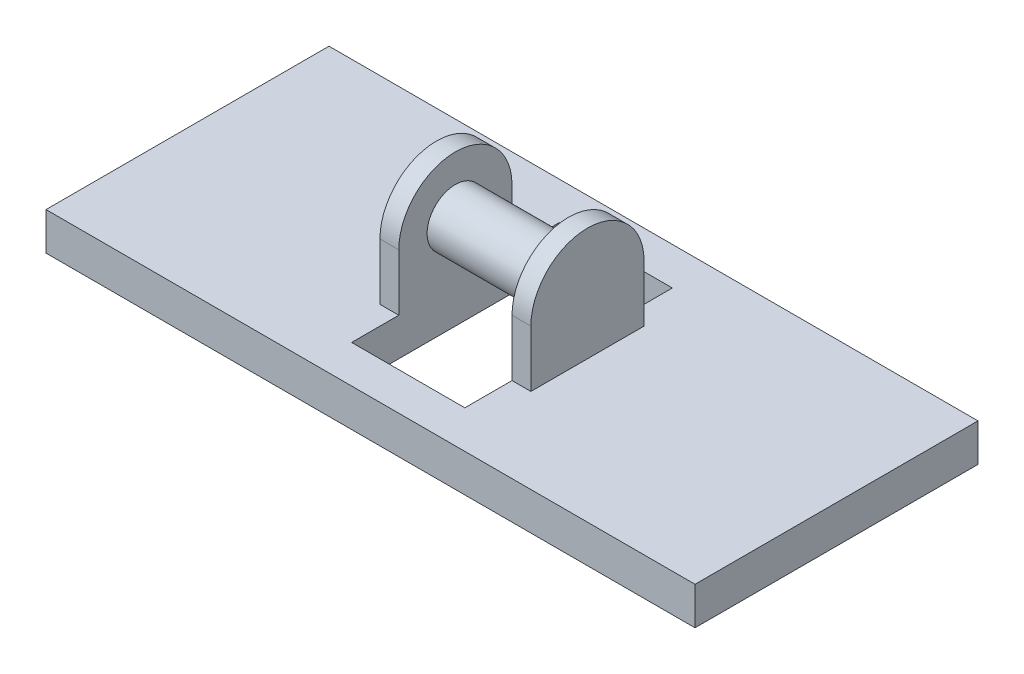
ISO-10303-21;
HEADER;
FILE_DESCRIPTION(('STEP AP214'),'2;1');
FILE_NAME('part.step','',(''),(''),'','','');
FILE_SCHEMA(('AUTOMOTIVE_DESIGN { 1 0 10303 214 1 1 1 1 }'));
ENDSEC;
DATA;
#1=APPLICATION_CONTEXT('core data for automotive mechanical design processes');
#2=APPLICATION_PROTOCOL_DEFINITION('international standard','automotive_design',2000,#1);
#3=PRODUCT_CONTEXT('',#1,'mechanical');
#4=PRODUCT('Part','Part','',(#3));
#5=PRODUCT_RELATED_PRODUCT_CATEGORY('part','',(#4));
#6=PRODUCT_DEFINITION_FORMATION('','',#4);
#7=PRODUCT_DEFINITION_CONTEXT('part definition',#1,'design');
#8=PRODUCT_DEFINITION('design','',#6,#7);
#9=PRODUCT_DEFINITION_SHAPE('','',#8);
#10=(LENGTH_UNIT() NAMED_UNIT(*) SI_UNIT(.MILLI.,.METRE.));
#11=(NAMED_UNIT(*) PLANE_ANGLE_UNIT() SI_UNIT($,.RADIAN.));
#12=(NAMED_UNIT(*) SI_UNIT($,.STERADIAN.) SOLID_ANGLE_UNIT());
#13=UNCERTAINTY_MEASURE_WITH_UNIT(LENGTH_MEASURE(1.E-05),#10,'distance_accuracy_value','');
#14=(GEOMETRIC_REPRESENTATION_CONTEXT(3) GLOBAL_UNCERTAINTY_ASSIGNED_CONTEXT((#13)) GLOBAL_UNIT_ASSIGNED_CONTEXT((#10,
#11,#12)) REPRESENTATION_CONTEXT('',''));
#15=CARTESIAN_POINT('',(0.,0.,0.));
#16=DIRECTION('',(0.,0.,1.));
#17=DIRECTION('',(1.,0.,0.));
#18=AXIS2_PLACEMENT_3D('',#15,#16,#17);
#19=CARTESIAN_POINT('',(0.,44.6,0.));
#20=DIRECTION('',(0.,-1.,0.));
#21=DIRECTION('',(0.,0.,-1.));
#22=AXIS2_PLACEMENT_3D('',#19,#20,#21);
#23=PLANE('',#22);
#24=DIRECTION('',(0.,0.,1.));
#25=VECTOR('',#24,1.);
#26=CARTESIAN_POINT('',(-17.2,44.6,12.));
#27=LINE('',#26,#25);
#28=CARTESIAN_POINT('',(-17.2,44.6,-3.00000000000001));
#29=VERTEX_POINT('',#28);
#30=CARTESIAN_POINT('',(-17.2,44.6,12.));
#31=VERTEX_POINT('',#30);
#32=EDGE_CURVE('E283',#29,#31,#27,.T.);
#33=ORIENTED_EDGE('',*,*,#32,.T.);
#34=DIRECTION('',(1.,0.,0.));
#35=VECTOR('',#34,1.);
#36=CARTESIAN_POINT('',(-17.2,44.6,12.));
#37=LINE('',#36,#35);
#38=CARTESIAN_POINT('',(17.2,44.6,12.));
#39=VERTEX_POINT('',#38);
#40=EDGE_CURVE('E287',#31,#39,#37,.T.);
#41=ORIENTED_EDGE('',*,*,#40,.T.);
#42=DIRECTION('',(0.,0.,-1.));
#43=VECTOR('',#42,1.);
#44=CARTESIAN_POINT('',(17.2,44.6,12.));
#45=LINE('',#44,#43);
#46=CARTESIAN_POINT('',(17.2,44.6,-3.00000000000001));
#47=VERTEX_POINT('',#46);
#48=EDGE_CURVE('E291',#39,#47,#45,.T.);
#49=ORIENTED_EDGE('',*,*,#48,.T.);
#50=DIRECTION('',(-1.,0.,0.));
#51=VECTOR('',#50,1.);
#52=CARTESIAN_POINT('',(-17.2,44.6,-3.00000000000001));
#53=LINE('',#52,#51);
#54=EDGE_CURVE('E294',#47,#29,#53,.T.);
#55=ORIENTED_EDGE('',*,*,#54,.T.);
#56=EDGE_LOOP('',(#33,#41,#49,#55));
#57=FACE_BOUND('',#56,.T.);
#58=DIRECTION('',(-1.,0.,0.));
#59=VECTOR('',#58,1.);
#60=CARTESIAN_POINT('',(3.99999999999999,44.6,1.49999999999999));
#61=LINE('',#60,#59);
#62=CARTESIAN_POINT('',(3.99999999999999,44.6,1.49999999999999));
#63=VERTEX_POINT('',#62);
#64=CARTESIAN_POINT('',(3.00000000000001,44.6,1.49999999999999));
#65=VERTEX_POINT('',#64);
#66=EDGE_CURVE('E50',#63,#65,#61,.T.);
#67=ORIENTED_EDGE('',*,*,#66,.F.);
#68=DIRECTION('',(0.,0.,-1.));
#69=VECTOR('',#68,1.);
#70=CARTESIAN_POINT('',(3.99999999999999,44.6,7.49999999999999));
#71=LINE('',#70,#69);
#72=CARTESIAN_POINT('',(3.99999999999999,44.6,7.49999999999999));
#73=VERTEX_POINT('',#72);
#74=EDGE_CURVE('E152',#73,#63,#71,.T.);
#75=ORIENTED_EDGE('',*,*,#74,.F.);
#76=DIRECTION('',(-1.,0.,0.));
#77=VECTOR('',#76,1.);
#78=CARTESIAN_POINT('',(3.99999999999999,44.6,7.49999999999999));
#79=LINE('',#78,#77);
#80=CARTESIAN_POINT('',(2.99999999999999,44.6,7.49999999999999));
#81=VERTEX_POINT('',#80);
#82=EDGE_CURVE('E161',#73,#81,#79,.T.);
#83=ORIENTED_EDGE('',*,*,#82,.T.);
#84=DIRECTION('',(0.,0.,-1.));
#85=VECTOR('',#84,1.);
#86=CARTESIAN_POINT('',(3.00000000000001,44.6,-1.00000000000001));
#87=LINE('',#86,#85);
#88=CARTESIAN_POINT('',(3.00000000000001,44.6,9.99999999999999));
#89=VERTEX_POINT('',#88);
#90=EDGE_CURVE('E248',#89,#81,#87,.T.);
#91=ORIENTED_EDGE('',*,*,#90,.F.);
#92=DIRECTION('',(1.,0.,0.));
#93=VECTOR('',#92,1.);
#94=CARTESIAN_POINT('',(-2.99999999999999,44.6,9.99999999999999));
#95=LINE('',#94,#93);
#96=CARTESIAN_POINT('',(-2.99999999999999,44.6,9.99999999999999));
#97=VERTEX_POINT('',#96);
#98=EDGE_CURVE('E260',#97,#89,#95,.T.);
#99=ORIENTED_EDGE('',*,*,#98,.F.);
#100=DIRECTION('',(0.,0.,1.));
#101=VECTOR('',#100,1.);
#102=CARTESIAN_POINT('',(-2.99999999999999,44.6,-1.00000000000001));
#103=LINE('',#102,#101);
#104=CARTESIAN_POINT('',(-2.99999999999999,44.6,7.49999999999999));
#105=VERTEX_POINT('',#104);
#106=EDGE_CURVE('E255',#105,#97,#103,.T.);
#107=ORIENTED_EDGE('',*,*,#106,.F.);
#108=DIRECTION('',(1.,0.,0.));
#109=VECTOR('',#108,1.);
#110=CARTESIAN_POINT('',(-3.99999999999999,44.6,7.49999999999999));
#111=LINE('',#110,#109);
#112=CARTESIAN_POINT('',(-3.99999999999999,44.6,7.49999999999999));
#113=VERTEX_POINT('',#112);
#114=EDGE_CURVE('E224',#113,#105,#111,.T.);
#115=ORIENTED_EDGE('',*,*,#114,.F.);
#116=DIRECTION('',(0.,0.,-1.));
#117=VECTOR('',#116,1.);
#118=CARTESIAN_POINT('',(-3.99999999999999,44.6,7.49999999999999));
#119=LINE('',#118,#117);
#120=CARTESIAN_POINT('',(-3.99999999999999,44.6,1.49999999999999));
#121=VERTEX_POINT('',#120);
#122=EDGE_CURVE('E197',#113,#121,#119,.T.);
#123=ORIENTED_EDGE('',*,*,#122,.T.);
#124=DIRECTION('',(1.,0.,0.));
#125=VECTOR('',#124,1.);
#126=CARTESIAN_POINT('',(-3.99999999999999,44.6,1.49999999999999));
#127=LINE('',#126,#125);
#128=CARTESIAN_POINT('',(-2.99999999999999,44.6,1.49999999999999));
#129=VERTEX_POINT('',#128);
#130=EDGE_CURVE('E214',#121,#129,#127,.T.);
#131=ORIENTED_EDGE('',*,*,#130,.T.);
#132=CARTESIAN_POINT('',(-2.99999999999999,44.6,-1.00000000000001));
#133=VERTEX_POINT('',#132);
#134=EDGE_CURVE('E256',#133,#129,#103,.T.);
#135=ORIENTED_EDGE('',*,*,#134,.F.);
#136=DIRECTION('',(-1.,0.,0.));
#137=VECTOR('',#136,1.);
#138=CARTESIAN_POINT('',(-2.99999999999999,44.6,-1.00000000000001));
#139=LINE('',#138,#137);
#140=CARTESIAN_POINT('',(3.00000000000001,44.6,-1.00000000000001));
#141=VERTEX_POINT('',#140);
#142=EDGE_CURVE('E251',#141,#133,#139,.T.);
#143=ORIENTED_EDGE('',*,*,#142,.F.);
#144=EDGE_CURVE('E247',#65,#141,#87,.T.);
#145=ORIENTED_EDGE('',*,*,#144,.F.);
#146=EDGE_LOOP('',(#67,#75,#83,#91,#99,#107,#115,#123,#131,#135,#143,#145));
#147=FACE_BOUND('',#146,.T.);
#148=ADVANCED_FACE('F34',(#57,#147),#23,.F.);
#149=CARTESIAN_POINT('',(-17.2,44.6,12.));
#150=DIRECTION('',(1.,0.,0.));
#151=DIRECTION('',(0.,0.,-1.));
#152=AXIS2_PLACEMENT_3D('',#149,#150,#151);
#153=PLANE('',#152);
#154=DIRECTION('',(0.,0.,1.));
#155=VECTOR('',#154,1.);
#156=CARTESIAN_POINT('',(-17.2,42.6,12.));
#157=LINE('',#156,#155);
#158=CARTESIAN_POINT('',(-17.2,42.6,-3.00000000000001));
#159=VERTEX_POINT('',#158);
#160=CARTESIAN_POINT('',(-17.2,42.6,12.));
#161=VERTEX_POINT('',#160);
#162=EDGE_CURVE('E282',#159,#161,#157,.T.);
#163=ORIENTED_EDGE('',*,*,#162,.T.);
#164=DIRECTION('',(0.,-1.,0.));
#165=VECTOR('',#164,1.);
#166=CARTESIAN_POINT('',(-17.2,44.6,12.));
#167=LINE('',#166,#165);
#168=EDGE_CURVE('E320',#31,#161,#167,.T.);
#169=ORIENTED_EDGE('',*,*,#168,.F.);
#170=ORIENTED_EDGE('',*,*,#32,.F.);
#171=DIRECTION('',(0.,-1.,0.));
#172=VECTOR('',#171,1.);
#173=CARTESIAN_POINT('',(-17.2,44.6,-3.00000000000001));
#174=LINE('',#173,#172);
#175=EDGE_CURVE('E297',#29,#159,#174,.T.);
#176=ORIENTED_EDGE('',*,*,#175,.T.);
#177=EDGE_LOOP('',(#163,#169,#170,#176));
#178=FACE_BOUND('',#177,.T.);
#179=ADVANCED_FACE('F36',(#178),#153,.F.);
#180=CARTESIAN_POINT('',(-17.2,44.6,12.));
#181=DIRECTION('',(0.,0.,-1.));
#182=DIRECTION('',(-1.,0.,0.));
#183=AXIS2_PLACEMENT_3D('',#180,#181,#182);
#184=PLANE('',#183);
#185=DIRECTION('',(1.,0.,0.));
#186=VECTOR('',#185,1.);
#187=CARTESIAN_POINT('',(-17.2,42.6,12.));
#188=LINE('',#187,#186);
#189=CARTESIAN_POINT('',(17.2,42.6,12.));
#190=VERTEX_POINT('',#189);
#191=EDGE_CURVE('E301',#161,#190,#188,.T.);
#192=ORIENTED_EDGE('',*,*,#191,.T.);
#193=DIRECTION('',(0.,-1.,0.));
#194=VECTOR('',#193,1.);
#195=CARTESIAN_POINT('',(17.2,44.6,12.));
#196=LINE('',#195,#194);
#197=EDGE_CURVE('E316',#39,#190,#196,.T.);
#198=ORIENTED_EDGE('',*,*,#197,.F.);
#199=ORIENTED_EDGE('',*,*,#40,.F.);
#200=ORIENTED_EDGE('',*,*,#168,.T.);
#201=EDGE_LOOP('',(#192,#198,#199,#200));
#202=FACE_BOUND('',#201,.T.);
#203=ADVANCED_FACE('F415',(#202),#184,.F.);
#204=CARTESIAN_POINT('',(17.2,44.6,12.));
#205=DIRECTION('',(-1.,0.,0.));
#206=DIRECTION('',(0.,0.,1.));
#207=AXIS2_PLACEMENT_3D('',#204,#205,#206);
#208=PLANE('',#207);
#209=DIRECTION('',(0.,0.,-1.));
#210=VECTOR('',#209,1.);
#211=CARTESIAN_POINT('',(17.2,42.6,12.));
#212=LINE('',#211,#210);
#213=CARTESIAN_POINT('',(17.2,42.6,-3.00000000000001));
#214=VERTEX_POINT('',#213);
#215=EDGE_CURVE('E304',#190,#214,#212,.T.);
#216=ORIENTED_EDGE('',*,*,#215,.T.);
#217=DIRECTION('',(0.,-1.,0.));
#218=VECTOR('',#217,1.);
#219=CARTESIAN_POINT('',(17.2,44.6,-3.00000000000001));
#220=LINE('',#219,#218);
#221=EDGE_CURVE('E312',#47,#214,#220,.T.);
#222=ORIENTED_EDGE('',*,*,#221,.F.);
#223=ORIENTED_EDGE('',*,*,#48,.F.);
#224=ORIENTED_EDGE('',*,*,#197,.T.);
#225=EDGE_LOOP('',(#216,#222,#223,#224));
#226=FACE_BOUND('',#225,.T.);
#227=ADVANCED_FACE('F412',(#226),#208,.F.);
#228=CARTESIAN_POINT('',(-17.2,44.6,-3.00000000000001));
#229=DIRECTION('',(0.,0.,1.));
#230=DIRECTION('',(1.,0.,0.));
#231=AXIS2_PLACEMENT_3D('',#228,#229,#230);
#232=PLANE('',#231);
#233=DIRECTION('',(-1.,0.,0.));
#234=VECTOR('',#233,1.);
#235=CARTESIAN_POINT('',(-17.2,42.6,-3.00000000000001));
#236=LINE('',#235,#234);
#237=EDGE_CURVE('E288',#214,#159,#236,.T.);
#238=ORIENTED_EDGE('',*,*,#237,.T.);
#239=ORIENTED_EDGE('',*,*,#175,.F.);
#240=ORIENTED_EDGE('',*,*,#54,.F.);
#241=ORIENTED_EDGE('',*,*,#221,.T.);
#242=EDGE_LOOP('',(#238,#239,#240,#241));
#243=FACE_BOUND('',#242,.T.);
#244=ADVANCED_FACE('F398',(#243),#232,.F.);
#245=CARTESIAN_POINT('',(0.,42.6,0.));
#246=DIRECTION('',(0.,-1.,0.));
#247=DIRECTION('',(0.,0.,-1.));
#248=AXIS2_PLACEMENT_3D('',#245,#246,#247);
#249=PLANE('',#248);
#250=DIRECTION('',(0.,0.,-1.));
#251=VECTOR('',#250,1.);
#252=CARTESIAN_POINT('',(3.00000000000001,42.6,-1.00000000000001));
#253=LINE('',#252,#251);
#254=CARTESIAN_POINT('',(3.00000000000001,42.6,9.99999999999999));
#255=VERTEX_POINT('',#254);
#256=CARTESIAN_POINT('',(3.00000000000001,42.6,-1.00000000000001));
#257=VERTEX_POINT('',#256);
#258=EDGE_CURVE('E243',#255,#257,#253,.T.);
#259=ORIENTED_EDGE('',*,*,#258,.T.);
#260=DIRECTION('',(-1.,0.,0.));
#261=VECTOR('',#260,1.);
#262=CARTESIAN_POINT('',(-2.99999999999999,42.6,-1.00000000000001));
#263=LINE('',#262,#261);
#264=CARTESIAN_POINT('',(-2.99999999999999,42.6,-1.00000000000001));
#265=VERTEX_POINT('',#264);
#266=EDGE_CURVE('E268',#257,#265,#263,.T.);
#267=ORIENTED_EDGE('',*,*,#266,.T.);
#268=DIRECTION('',(0.,0.,1.));
#269=VECTOR('',#268,1.);
#270=CARTESIAN_POINT('',(-2.99999999999999,42.6,-1.00000000000001));
#271=LINE('',#270,#269);
#272=CARTESIAN_POINT('',(-2.99999999999999,42.6,9.99999999999999));
#273=VERTEX_POINT('',#272);
#274=EDGE_CURVE('E227',#265,#273,#271,.T.);
#275=ORIENTED_EDGE('',*,*,#274,.T.);
#276=DIRECTION('',(1.,0.,0.));
#277=VECTOR('',#276,1.);
#278=CARTESIAN_POINT('',(-2.99999999999999,42.6,9.99999999999999));
#279=LINE('',#278,#277);
#280=EDGE_CURVE('E239',#273,#255,#279,.T.);
#281=ORIENTED_EDGE('',*,*,#280,.T.);
#282=EDGE_LOOP('',(#259,#267,#275,#281));
#283=FACE_BOUND('',#282,.T.);
#284=ORIENTED_EDGE('',*,*,#162,.F.);
#285=ORIENTED_EDGE('',*,*,#237,.F.);
#286=ORIENTED_EDGE('',*,*,#215,.F.);
#287=ORIENTED_EDGE('',*,*,#191,.F.);
#288=EDGE_LOOP('',(#284,#285,#286,#287));
#289=FACE_BOUND('',#288,.T.);
#290=ADVANCED_FACE('F395',(#283,#289),#249,.T.);
#291=CARTESIAN_POINT('',(3.00000000000001,-11.301,-1.00000000000001));
#292=DIRECTION('',(1.,0.,0.));
#293=DIRECTION('',(0.,0.,-1.));
#294=AXIS2_PLACEMENT_3D('',#291,#292,#293);
#295=PLANE('',#294);
#296=CARTESIAN_POINT('',(3.00000000000001,47.6,4.49999999999999));
#297=DIRECTION('',(1.,0.,0.));
#298=DIRECTION('',(0.,0.,-1.));
#299=AXIS2_PLACEMENT_3D('',#296,#297,#298);
#300=CIRCLE('',#299,1.5);
#301=CARTESIAN_POINT('',(3.00000000000001,47.6,2.99999999999999));
#302=VERTEX_POINT('',#301);
#303=EDGE_CURVE('E11',#302,#302,#300,.F.);
#304=ORIENTED_EDGE('',*,*,#303,.F.);
#305=EDGE_LOOP('',(#304));
#306=FACE_BOUND('',#305,.T.);
#307=DIRECTION('',(0.,1.,0.));
#308=VECTOR('',#307,1.);
#309=CARTESIAN_POINT('',(3.00000000000001,-11.301,9.99999999999999));
#310=LINE('',#309,#308);
#311=EDGE_CURVE('E265',#255,#89,#310,.T.);
#312=ORIENTED_EDGE('',*,*,#311,.T.);
#313=ORIENTED_EDGE('',*,*,#90,.T.);
#314=DIRECTION('',(0.,-1.,0.));
#315=VECTOR('',#314,1.);
#316=CARTESIAN_POINT('',(2.99999999999999,47.6,7.49999999999999));
#317=LINE('',#316,#315);
#318=CARTESIAN_POINT('',(2.99999999999999,47.6,7.49999999999999));
#319=VERTEX_POINT('',#318);
#320=EDGE_CURVE('E164',#319,#81,#317,.T.);
#321=ORIENTED_EDGE('',*,*,#320,.F.);
#322=CARTESIAN_POINT('',(2.99999999999999,47.6,4.49999999999999));
#323=DIRECTION('',(1.,0.,0.));
#324=DIRECTION('',(0.,0.,-1.));
#325=AXIS2_PLACEMENT_3D('',#322,#323,#324);
#326=CIRCLE('',#325,3.);
#327=CARTESIAN_POINT('',(2.99999999999999,47.6,1.49999999999999));
#328=VERTEX_POINT('',#327);
#329=EDGE_CURVE('E178',#328,#319,#326,.T.);
#330=ORIENTED_EDGE('',*,*,#329,.F.);
#331=DIRECTION('',(0.,1.,0.));
#332=VECTOR('',#331,1.);
#333=CARTESIAN_POINT('',(2.99999999999999,44.6,1.49999999999999));
#334=LINE('',#333,#332);
#335=EDGE_CURVE('E174',#65,#328,#334,.T.);
#336=ORIENTED_EDGE('',*,*,#335,.F.);
#337=ORIENTED_EDGE('',*,*,#144,.T.);
#338=DIRECTION('',(0.,1.,0.));
#339=VECTOR('',#338,1.);
#340=CARTESIAN_POINT('',(3.00000000000001,-11.301,-1.00000000000001));
#341=LINE('',#340,#339);
#342=EDGE_CURVE('E264',#257,#141,#341,.T.);
#343=ORIENTED_EDGE('',*,*,#342,.F.);
#344=ORIENTED_EDGE('',*,*,#258,.F.);
#345=EDGE_LOOP('',(#312,#313,#321,#330,#336,#337,#343,#344));
#346=FACE_BOUND('',#345,.T.);
#347=ADVANCED_FACE('F386',(#306,#346),#295,.F.);
#348=CARTESIAN_POINT('',(-2.99999999999999,-11.301,9.99999999999999));
#349=DIRECTION('',(0.,0.,1.));
#350=DIRECTION('',(1.,0.,0.));
#351=AXIS2_PLACEMENT_3D('',#348,#349,#350);
#352=PLANE('',#351);
#353=DIRECTION('',(0.,1.,0.));
#354=VECTOR('',#353,1.);
#355=CARTESIAN_POINT('',(-2.99999999999999,-11.301,9.99999999999999));
#356=LINE('',#355,#354);
#357=EDGE_CURVE('E269',#273,#97,#356,.T.);
#358=ORIENTED_EDGE('',*,*,#357,.T.);
#359=ORIENTED_EDGE('',*,*,#98,.T.);
#360=ORIENTED_EDGE('',*,*,#311,.F.);
#361=ORIENTED_EDGE('',*,*,#280,.F.);
#362=EDGE_LOOP('',(#358,#359,#360,#361));
#363=FACE_BOUND('',#362,.T.);
#364=ADVANCED_FACE('F334',(#363),#352,.F.);
#365=CARTESIAN_POINT('',(-2.99999999999999,-11.301,-1.00000000000001));
#366=DIRECTION('',(-1.,0.,0.));
#367=DIRECTION('',(0.,0.,1.));
#368=AXIS2_PLACEMENT_3D('',#365,#366,#367);
#369=PLANE('',#368);
#370=CARTESIAN_POINT('',(-2.99999999999999,47.6,4.49999999999999));
#371=DIRECTION('',(-1.,0.,0.));
#372=DIRECTION('',(0.,0.,1.));
#373=AXIS2_PLACEMENT_3D('',#370,#371,#372);
#374=CIRCLE('',#373,1.5);
#375=CARTESIAN_POINT('',(-2.99999999999999,47.6,2.99999999999999));
#376=VERTEX_POINT('',#375);
#377=EDGE_CURVE('E43',#376,#376,#374,.F.);
#378=ORIENTED_EDGE('',*,*,#377,.F.);
#379=EDGE_LOOP('',(#378));
#380=FACE_BOUND('',#379,.T.);
#381=DIRECTION('',(0.,1.,0.));
#382=VECTOR('',#381,1.);
#383=CARTESIAN_POINT('',(-2.99999999999999,-11.301,-1.00000000000001));
#384=LINE('',#383,#382);
#385=EDGE_CURVE('E273',#265,#133,#384,.T.);
#386=ORIENTED_EDGE('',*,*,#385,.T.);
#387=ORIENTED_EDGE('',*,*,#134,.T.);
#388=DIRECTION('',(0.,1.,0.));
#389=VECTOR('',#388,1.);
#390=CARTESIAN_POINT('',(-2.99999999999999,44.6,1.49999999999999));
#391=LINE('',#390,#389);
#392=CARTESIAN_POINT('',(-2.99999999999999,47.6,1.49999999999999));
#393=VERTEX_POINT('',#392);
#394=EDGE_CURVE('E58',#129,#393,#391,.T.);
#395=ORIENTED_EDGE('',*,*,#394,.T.);
#396=CARTESIAN_POINT('',(-2.99999999999999,47.6,4.49999999999999));
#397=DIRECTION('',(1.,0.,0.));
#398=DIRECTION('',(0.,0.,-1.));
#399=AXIS2_PLACEMENT_3D('',#396,#397,#398);
#400=CIRCLE('',#399,3.);
#401=CARTESIAN_POINT('',(-2.99999999999999,47.6,7.49999999999999));
#402=VERTEX_POINT('',#401);
#403=EDGE_CURVE('E217',#393,#402,#400,.T.);
#404=ORIENTED_EDGE('',*,*,#403,.T.);
#405=DIRECTION('',(0.,-1.,0.));
#406=VECTOR('',#405,1.);
#407=CARTESIAN_POINT('',(-2.99999999999999,47.6,7.49999999999999));
#408=LINE('',#407,#406);
#409=EDGE_CURVE('E202',#402,#105,#408,.T.);
#410=ORIENTED_EDGE('',*,*,#409,.T.);
#411=ORIENTED_EDGE('',*,*,#106,.T.);
#412=ORIENTED_EDGE('',*,*,#357,.F.);
#413=ORIENTED_EDGE('',*,*,#274,.F.);
#414=EDGE_LOOP('',(#386,#387,#395,#404,#410,#411,#412,#413));
#415=FACE_BOUND('',#414,.T.);
#416=ADVANCED_FACE('F330',(#380,#415),#369,.F.);
#417=CARTESIAN_POINT('',(-2.99999999999999,-11.301,-1.00000000000001));
#418=DIRECTION('',(0.,0.,-1.));
#419=DIRECTION('',(-1.,0.,0.));
#420=AXIS2_PLACEMENT_3D('',#417,#418,#419);
#421=PLANE('',#420);
#422=ORIENTED_EDGE('',*,*,#342,.T.);
#423=ORIENTED_EDGE('',*,*,#142,.T.);
#424=ORIENTED_EDGE('',*,*,#385,.F.);
#425=ORIENTED_EDGE('',*,*,#266,.F.);
#426=EDGE_LOOP('',(#422,#423,#424,#425));
#427=FACE_BOUND('',#426,.T.);
#428=ADVANCED_FACE('F333',(#427),#421,.F.);
#429=CARTESIAN_POINT('',(-3.99999999999999,47.6,7.49999999999999));
#430=DIRECTION('',(0.,0.,1.));
#431=DIRECTION('',(0.,-1.,0.));
#432=AXIS2_PLACEMENT_3D('',#429,#430,#431);
#433=PLANE('',#432);
#434=ORIENTED_EDGE('',*,*,#409,.F.);
#435=DIRECTION('',(1.,0.,0.));
#436=VECTOR('',#435,1.);
#437=CARTESIAN_POINT('',(-3.99999999999999,47.6,7.49999999999999));
#438=LINE('',#437,#436);
#439=CARTESIAN_POINT('',(-3.99999999999999,47.6,7.49999999999999));
#440=VERTEX_POINT('',#439);
#441=EDGE_CURVE('E228',#440,#402,#438,.T.);
#442=ORIENTED_EDGE('',*,*,#441,.F.);
#443=DIRECTION('',(0.,-1.,0.));
#444=VECTOR('',#443,1.);
#445=CARTESIAN_POINT('',(-3.99999999999999,47.6,7.49999999999999));
#446=LINE('',#445,#444);
#447=EDGE_CURVE('E210',#440,#113,#446,.T.);
#448=ORIENTED_EDGE('',*,*,#447,.T.);
#449=ORIENTED_EDGE('',*,*,#114,.T.);
#450=EDGE_LOOP('',(#434,#442,#448,#449));
#451=FACE_BOUND('',#450,.T.);
#452=ADVANCED_FACE('F355',(#451),#433,.T.);
#453=CARTESIAN_POINT('',(-3.99999999999999,47.6,4.49999999999999));
#454=DIRECTION('',(1.,0.,0.));
#455=DIRECTION('',(0.,0.,-1.));
#456=AXIS2_PLACEMENT_3D('',#453,#454,#455);
#457=CYLINDRICAL_SURFACE('',#456,3.);
#458=ORIENTED_EDGE('',*,*,#403,.F.);
#459=DIRECTION('',(1.,0.,0.));
#460=VECTOR('',#459,1.);
#461=CARTESIAN_POINT('',(-3.99999999999999,47.6,1.49999999999999));
#462=LINE('',#461,#460);
#463=CARTESIAN_POINT('',(-3.99999999999999,47.6,1.49999999999999));
#464=VERTEX_POINT('',#463);
#465=EDGE_CURVE('E231',#464,#393,#462,.T.);
#466=ORIENTED_EDGE('',*,*,#465,.F.);
#467=CARTESIAN_POINT('',(-3.99999999999999,47.6,4.49999999999999));
#468=DIRECTION('',(1.,0.,0.));
#469=DIRECTION('',(0.,0.,-1.));
#470=AXIS2_PLACEMENT_3D('',#467,#468,#469);
#471=CIRCLE('',#470,3.);
#472=EDGE_CURVE('E206',#464,#440,#471,.T.);
#473=ORIENTED_EDGE('',*,*,#472,.T.);
#474=ORIENTED_EDGE('',*,*,#441,.T.);
#475=EDGE_LOOP('',(#458,#466,#473,#474));
#476=FACE_BOUND('',#475,.T.);
#477=ADVANCED_FACE('F351',(#476),#457,.T.);
#478=CARTESIAN_POINT('',(-3.99999999999999,44.6,1.49999999999999));
#479=DIRECTION('',(0.,0.,-1.));
#480=DIRECTION('',(0.,1.,0.));
#481=AXIS2_PLACEMENT_3D('',#478,#479,#480);
#482=PLANE('',#481);
#483=ORIENTED_EDGE('',*,*,#394,.F.);
#484=ORIENTED_EDGE('',*,*,#130,.F.);
#485=DIRECTION('',(0.,1.,0.));
#486=VECTOR('',#485,1.);
#487=CARTESIAN_POINT('',(-3.99999999999999,44.6,1.49999999999999));
#488=LINE('',#487,#486);
#489=EDGE_CURVE('E201',#121,#464,#488,.T.);
#490=ORIENTED_EDGE('',*,*,#489,.T.);
#491=ORIENTED_EDGE('',*,*,#465,.T.);
#492=EDGE_LOOP('',(#483,#484,#490,#491));
#493=FACE_BOUND('',#492,.T.);
#494=ADVANCED_FACE('F344',(#493),#482,.T.);
#495=CARTESIAN_POINT('',(-3.99999999999999,47.6,4.49999999999999));
#496=DIRECTION('',(1.,0.,0.));
#497=DIRECTION('',(0.,0.,-1.));
#498=AXIS2_PLACEMENT_3D('',#495,#496,#497);
#499=PLANE('',#498);
#500=ORIENTED_EDGE('',*,*,#122,.F.);
#501=ORIENTED_EDGE('',*,*,#447,.F.);
#502=ORIENTED_EDGE('',*,*,#472,.F.);
#503=ORIENTED_EDGE('',*,*,#489,.F.);
#504=EDGE_LOOP('',(#500,#501,#502,#503));
#505=FACE_BOUND('',#504,.T.);
#506=ADVANCED_FACE('F347',(#505),#499,.F.);
#507=CARTESIAN_POINT('',(3.99999999999999,44.6,1.49999999999999));
#508=DIRECTION('',(0.,0.,1.));
#509=DIRECTION('',(0.,-1.,0.));
#510=AXIS2_PLACEMENT_3D('',#507,#508,#509);
#511=PLANE('',#510);
#512=ORIENTED_EDGE('',*,*,#335,.T.);
#513=DIRECTION('',(-1.,0.,0.));
#514=VECTOR('',#513,1.);
#515=CARTESIAN_POINT('',(3.99999999999999,47.6,1.49999999999999));
#516=LINE('',#515,#514);
#517=CARTESIAN_POINT('',(3.99999999999999,47.6,1.49999999999999));
#518=VERTEX_POINT('',#517);
#519=EDGE_CURVE('E191',#518,#328,#516,.T.);
#520=ORIENTED_EDGE('',*,*,#519,.F.);
#521=DIRECTION('',(0.,1.,0.));
#522=VECTOR('',#521,1.);
#523=CARTESIAN_POINT('',(3.99999999999999,44.6,1.49999999999999));
#524=LINE('',#523,#522);
#525=EDGE_CURVE('E170',#63,#518,#524,.T.);
#526=ORIENTED_EDGE('',*,*,#525,.F.);
#527=ORIENTED_EDGE('',*,*,#66,.T.);
#528=EDGE_LOOP('',(#512,#520,#526,#527));
#529=FACE_BOUND('',#528,.T.);
#530=ADVANCED_FACE('F389',(#529),#511,.F.);
#531=CARTESIAN_POINT('',(3.99999999999999,47.6,4.49999999999999));
#532=DIRECTION('',(-1.,0.,0.));
#533=DIRECTION('',(0.,0.,1.));
#534=AXIS2_PLACEMENT_3D('',#531,#532,#533);
#535=CYLINDRICAL_SURFACE('',#534,3.);
#536=ORIENTED_EDGE('',*,*,#329,.T.);
#537=DIRECTION('',(-1.,0.,0.));
#538=VECTOR('',#537,1.);
#539=CARTESIAN_POINT('',(3.99999999999999,47.6,7.49999999999999));
#540=LINE('',#539,#538);
#541=CARTESIAN_POINT('',(3.99999999999999,47.6,7.49999999999999));
#542=VERTEX_POINT('',#541);
#543=EDGE_CURVE('E169',#542,#319,#540,.T.);
#544=ORIENTED_EDGE('',*,*,#543,.F.);
#545=CARTESIAN_POINT('',(3.99999999999999,47.6,4.49999999999999));
#546=DIRECTION('',(1.,0.,0.));
#547=DIRECTION('',(0.,0.,-1.));
#548=AXIS2_PLACEMENT_3D('',#545,#546,#547);
#549=CIRCLE('',#548,3.);
#550=EDGE_CURVE('E154',#518,#542,#549,.T.);
#551=ORIENTED_EDGE('',*,*,#550,.F.);
#552=ORIENTED_EDGE('',*,*,#519,.T.);
#553=EDGE_LOOP('',(#536,#544,#551,#552));
#554=FACE_BOUND('',#553,.T.);
#555=ADVANCED_FACE('F391',(#554),#535,.T.);
#556=CARTESIAN_POINT('',(3.99999999999999,47.6,7.49999999999999));
#557=DIRECTION('',(0.,0.,-1.));
#558=DIRECTION('',(0.,1.,0.));
#559=AXIS2_PLACEMENT_3D('',#556,#557,#558);
#560=PLANE('',#559);
#561=ORIENTED_EDGE('',*,*,#320,.T.);
#562=ORIENTED_EDGE('',*,*,#82,.F.);
#563=DIRECTION('',(0.,-1.,0.));
#564=VECTOR('',#563,1.);
#565=CARTESIAN_POINT('',(3.99999999999999,47.6,7.49999999999999));
#566=LINE('',#565,#564);
#567=EDGE_CURVE('E148',#542,#73,#566,.T.);
#568=ORIENTED_EDGE('',*,*,#567,.F.);
#569=ORIENTED_EDGE('',*,*,#543,.T.);
#570=EDGE_LOOP('',(#561,#562,#568,#569));
#571=FACE_BOUND('',#570,.T.);
#572=ADVANCED_FACE('F162',(#571),#560,.F.);
#573=CARTESIAN_POINT('',(3.99999999999999,47.6,4.49999999999999));
#574=DIRECTION('',(-1.,0.,0.));
#575=DIRECTION('',(0.,0.,-1.));
#576=AXIS2_PLACEMENT_3D('',#573,#574,#575);
#577=PLANE('',#576);
#578=ORIENTED_EDGE('',*,*,#74,.T.);
#579=ORIENTED_EDGE('',*,*,#525,.T.);
#580=ORIENTED_EDGE('',*,*,#550,.T.);
#581=ORIENTED_EDGE('',*,*,#567,.T.);
#582=EDGE_LOOP('',(#578,#579,#580,#581));
#583=FACE_BOUND('',#582,.T.);
#584=ADVANCED_FACE('F150',(#583),#577,.F.);
#585=CARTESIAN_POINT('',(-17.202,47.6,4.49999999999999));
#586=DIRECTION('',(1.,0.,0.));
#587=DIRECTION('',(0.,0.,-1.));
#588=AXIS2_PLACEMENT_3D('',#585,#586,#587);
#589=CYLINDRICAL_SURFACE('',#588,1.5);
#590=CARTESIAN_POINT('',(3.00000000000001,47.6,2.99999999999999));
#591=CARTESIAN_POINT('',(2.93750000000001,47.6,2.99999999999999));
#592=CARTESIAN_POINT('',(2.87500000000001,47.6,2.99999999999999));
#593=CARTESIAN_POINT('',(2.75000000000001,47.6,2.99999999999999));
#594=CARTESIAN_POINT('',(2.68750000000001,47.6,2.99999999999999));
#595=CARTESIAN_POINT('',(2.56250000000001,47.6,2.99999999999999));
#596=CARTESIAN_POINT('',(2.50000000000001,47.6,2.99999999999999));
#597=CARTESIAN_POINT('',(2.37500000000001,47.6,2.99999999999999));
#598=CARTESIAN_POINT('',(2.31250000000001,47.6,2.99999999999999));
#599=CARTESIAN_POINT('',(2.18750000000001,47.6,2.99999999999999));
#600=CARTESIAN_POINT('',(2.12500000000001,47.6,2.99999999999999));
#601=CARTESIAN_POINT('',(2.00000000000001,47.6,2.99999999999999));
#602=CARTESIAN_POINT('',(1.93750000000001,47.6,2.99999999999999));
#603=CARTESIAN_POINT('',(1.81250000000001,47.6,2.99999999999999));
#604=CARTESIAN_POINT('',(1.75000000000001,47.6,2.99999999999999));
#605=CARTESIAN_POINT('',(1.62500000000001,47.6,2.99999999999999));
#606=CARTESIAN_POINT('',(1.56250000000001,47.6,2.99999999999999));
#607=CARTESIAN_POINT('',(1.43750000000001,47.6,2.99999999999999));
#608=CARTESIAN_POINT('',(1.37500000000001,47.6,2.99999999999999));
#609=CARTESIAN_POINT('',(1.25000000000001,47.6,2.99999999999999));
#610=CARTESIAN_POINT('',(1.18750000000001,47.6,2.99999999999999));
#611=CARTESIAN_POINT('',(1.06250000000001,47.6,2.99999999999999));
#612=CARTESIAN_POINT('',(1.00000000000001,47.6,2.99999999999999));
#613=CARTESIAN_POINT('',(0.875000000000011,47.6,2.99999999999999));
#614=CARTESIAN_POINT('',(0.812500000000011,47.6,2.99999999999999));
#615=CARTESIAN_POINT('',(0.687500000000011,47.6,2.99999999999999));
#616=CARTESIAN_POINT('',(0.625000000000011,47.6,2.99999999999999));
#617=CARTESIAN_POINT('',(0.500000000000011,47.6,2.99999999999999));
#618=CARTESIAN_POINT('',(0.437500000000011,47.6,2.99999999999999));
#619=CARTESIAN_POINT('',(0.312500000000011,47.6,2.99999999999999));
#620=CARTESIAN_POINT('',(0.250000000000011,47.6,2.99999999999999));
#621=CARTESIAN_POINT('',(0.125000000000011,47.6,2.99999999999999));
#622=CARTESIAN_POINT('',(0.0625000000000104,47.6,2.99999999999999));
#623=CARTESIAN_POINT('',(-0.0624999999999896,47.6,2.99999999999999));
#624=CARTESIAN_POINT('',(-0.12499999999999,47.6,2.99999999999999));
#625=CARTESIAN_POINT('',(-0.24999999999999,47.6,2.99999999999999));
#626=CARTESIAN_POINT('',(-0.31249999999999,47.6,2.99999999999999));
#627=CARTESIAN_POINT('',(-0.43749999999999,47.6,2.99999999999999));
#628=CARTESIAN_POINT('',(-0.49999999999999,47.6,2.99999999999999));
#629=CARTESIAN_POINT('',(-0.62499999999999,47.6,2.99999999999999));
#630=CARTESIAN_POINT('',(-0.68749999999999,47.6,2.99999999999999));
#631=CARTESIAN_POINT('',(-0.81249999999999,47.6,2.99999999999999));
#632=CARTESIAN_POINT('',(-0.87499999999999,47.6,2.99999999999999));
#633=CARTESIAN_POINT('',(-0.999999999999989,47.6,2.99999999999999));
#634=CARTESIAN_POINT('',(-1.06249999999999,47.6,2.99999999999999));
#635=CARTESIAN_POINT('',(-1.18749999999999,47.6,2.99999999999999));
#636=CARTESIAN_POINT('',(-1.24999999999999,47.6,2.99999999999999));
#637=CARTESIAN_POINT('',(-1.37499999999999,47.6,2.99999999999999));
#638=CARTESIAN_POINT('',(-1.43749999999999,47.6,2.99999999999999));
#639=CARTESIAN_POINT('',(-1.56249999999999,47.6,2.99999999999999));
#640=CARTESIAN_POINT('',(-1.62499999999999,47.6,2.99999999999999));
#641=CARTESIAN_POINT('',(-1.74999999999999,47.6,2.99999999999999));
#642=CARTESIAN_POINT('',(-1.81249999999999,47.6,2.99999999999999));
#643=CARTESIAN_POINT('',(-1.93749999999999,47.6,2.99999999999999));
#644=CARTESIAN_POINT('',(-1.99999999999999,47.6,2.99999999999999));
#645=CARTESIAN_POINT('',(-2.12499999999999,47.6,2.99999999999999));
#646=CARTESIAN_POINT('',(-2.18749999999999,47.6,2.99999999999999));
#647=CARTESIAN_POINT('',(-2.31249999999999,47.6,2.99999999999999));
#648=CARTESIAN_POINT('',(-2.37499999999999,47.6,2.99999999999999));
#649=CARTESIAN_POINT('',(-2.49999999999999,47.6,2.99999999999999));
#650=CARTESIAN_POINT('',(-2.56249999999999,47.6,2.99999999999999));
#651=CARTESIAN_POINT('',(-2.68749999999999,47.6,2.99999999999999));
#652=CARTESIAN_POINT('',(-2.74999999999999,47.6,2.99999999999999));
#653=CARTESIAN_POINT('',(-2.87499999999999,47.6,2.99999999999999));
#654=CARTESIAN_POINT('',(-2.93749999999999,47.6,2.99999999999999));
#655=CARTESIAN_POINT('',(-2.99999999999999,47.6,2.99999999999999));
#656=B_SPLINE_CURVE_WITH_KNOTS('',3,(#590,#591,#592,#593,#594,#595,#596,#597,#598,#599,#600,
#601,#602,#603,#604,#605,#606,#607,#608,#609,#610,#611,#612,#613,#614,#615,#616,#617,#618,#619,
#620,#621,#622,#623,#624,#625,#626,#627,#628,#629,#630,#631,#632,#633,#634,#635,#636,#637,#638,
#639,#640,#641,#642,#643,#644,#645,#646,#647,#648,#649,#650,#651,#652,#653,#654,#655),
.UNSPECIFIED.,.F.,.F.,(4,2,2,2,2,2,2,2,2,2,2,2,2,2,2,2,2,2,2,2,2,2,2,2,2,2,2,2,2,2,2,2,4),(0.,
0.1875,0.375,0.5625,0.750000000000001,0.937500000000001,1.125,1.3125,1.5,1.6875,1.875,2.0625,
2.25,2.4375,2.625,2.8125,3.,3.1875,3.375,3.5625,3.75,3.9375,4.125,4.3125,4.5,4.6875,4.875,
5.0625,5.25,5.4375,5.625,5.8125,6.),.UNSPECIFIED.);
#657=EDGE_CURVE('BSEAM328',#302,#376,#656,.T.);
#658=ORIENTED_EDGE('',*,*,#303,.T.);
#659=ORIENTED_EDGE('',*,*,#377,.T.);
#660=ORIENTED_EDGE('',*,*,#657,.T.);
#661=ORIENTED_EDGE('',*,*,#657,.F.);
#662=EDGE_LOOP('',(#658,#660,#659,#661));
#663=FACE_BOUND('',#662,.T.);
#664=ADVANCED_FACE('F328',(#663),#589,.T.);
#665=CLOSED_SHELL('',(#148,#179,#203,#227,#244,#290,#347,#364,#416,#428,#452,#477,#494,#506,
#530,#555,#572,#584,#664));
#666=MANIFOLD_SOLID_BREP('B2',#665);
#667=ADVANCED_BREP_SHAPE_REPRESENTATION('',(#18,#666),#14);
#668=SHAPE_DEFINITION_REPRESENTATION(#9,#667);
ENDSEC;
END-ISO-10303-21;
